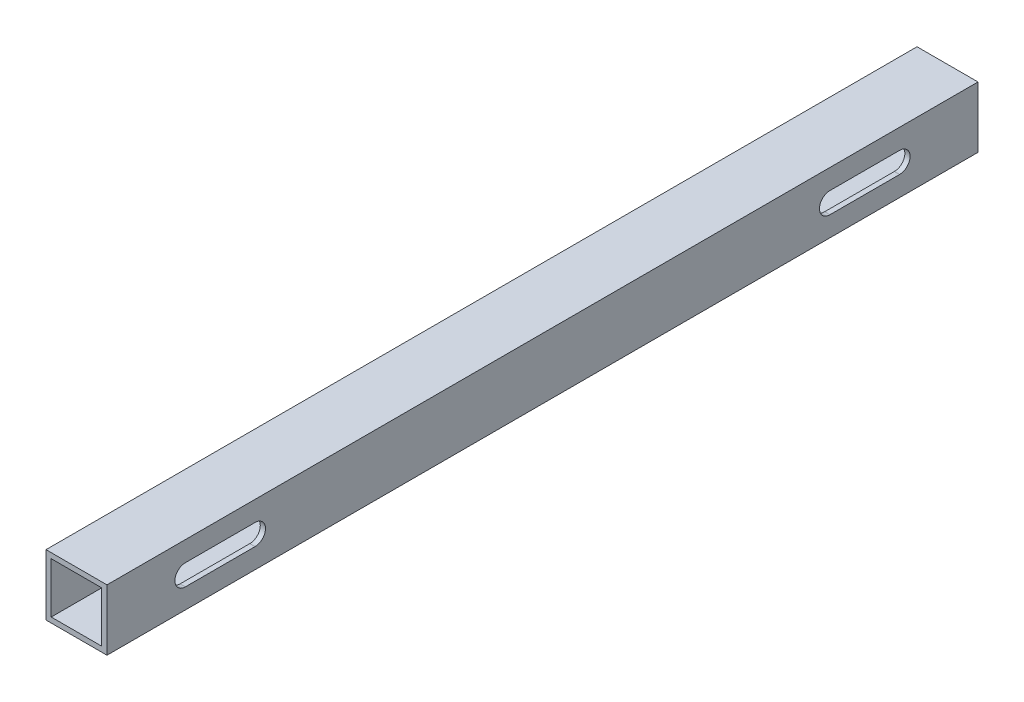
ISO-10303-21;
HEADER;
FILE_DESCRIPTION(('STEP AP214'),'2;1');
FILE_NAME('part.step','',(''),(''),'','','');
FILE_SCHEMA(('AUTOMOTIVE_DESIGN { 1 0 10303 214 1 1 1 1 }'));
ENDSEC;
DATA;
#1=APPLICATION_CONTEXT('core data for automotive mechanical design processes');
#2=APPLICATION_PROTOCOL_DEFINITION('international standard','automotive_design',2000,#1);
#3=PRODUCT_CONTEXT('',#1,'mechanical');
#4=PRODUCT('Part','Part','',(#3));
#5=PRODUCT_RELATED_PRODUCT_CATEGORY('part','',(#4));
#6=PRODUCT_DEFINITION_FORMATION('','',#4);
#7=PRODUCT_DEFINITION_CONTEXT('part definition',#1,'design');
#8=PRODUCT_DEFINITION('design','',#6,#7);
#9=PRODUCT_DEFINITION_SHAPE('','',#8);
#10=(LENGTH_UNIT() NAMED_UNIT(*) SI_UNIT(.MILLI.,.METRE.));
#11=(NAMED_UNIT(*) PLANE_ANGLE_UNIT() SI_UNIT($,.RADIAN.));
#12=(NAMED_UNIT(*) SI_UNIT($,.STERADIAN.) SOLID_ANGLE_UNIT());
#13=UNCERTAINTY_MEASURE_WITH_UNIT(LENGTH_MEASURE(1.E-05),#10,'distance_accuracy_value','');
#14=(GEOMETRIC_REPRESENTATION_CONTEXT(3) GLOBAL_UNCERTAINTY_ASSIGNED_CONTEXT((#13)) GLOBAL_UNIT_ASSIGNED_CONTEXT((#10,
#11,#12)) REPRESENTATION_CONTEXT('',''));
#15=CARTESIAN_POINT('',(0.,0.,0.));
#16=DIRECTION('',(0.,0.,1.));
#17=DIRECTION('',(1.,0.,0.));
#18=AXIS2_PLACEMENT_3D('',#15,#16,#17);
#19=CARTESIAN_POINT('',(0.,0.,500.));
#20=DIRECTION('',(0.,0.,-1.));
#21=DIRECTION('',(-1.,0.,0.));
#22=AXIS2_PLACEMENT_3D('',#19,#20,#21);
#23=PLANE('',#22);
#24=DIRECTION('',(0.,1.,0.));
#25=VECTOR('',#24,1.);
#26=CARTESIAN_POINT('',(17.5,-17.5,500.));
#27=LINE('',#26,#25);
#28=CARTESIAN_POINT('',(17.5,-17.5,500.));
#29=VERTEX_POINT('',#28);
#30=CARTESIAN_POINT('',(17.5,17.5,500.));
#31=VERTEX_POINT('',#30);
#32=EDGE_CURVE('E321',#29,#31,#27,.T.);
#33=ORIENTED_EDGE('',*,*,#32,.T.);
#34=DIRECTION('',(-1.,0.,0.));
#35=VECTOR('',#34,1.);
#36=CARTESIAN_POINT('',(-17.5,17.5,500.));
#37=LINE('',#36,#35);
#38=CARTESIAN_POINT('',(-17.5,17.5,500.));
#39=VERTEX_POINT('',#38);
#40=EDGE_CURVE('E324',#31,#39,#37,.T.);
#41=ORIENTED_EDGE('',*,*,#40,.T.);
#42=DIRECTION('',(0.,-1.,0.));
#43=VECTOR('',#42,1.);
#44=CARTESIAN_POINT('',(-17.5,-17.5,500.));
#45=LINE('',#44,#43);
#46=CARTESIAN_POINT('',(-17.5,-17.5,500.));
#47=VERTEX_POINT('',#46);
#48=EDGE_CURVE('E327',#39,#47,#45,.T.);
#49=ORIENTED_EDGE('',*,*,#48,.T.);
#50=DIRECTION('',(1.,0.,0.));
#51=VECTOR('',#50,1.);
#52=CARTESIAN_POINT('',(-17.5,-17.5,500.));
#53=LINE('',#52,#51);
#54=EDGE_CURVE('E329',#47,#29,#53,.T.);
#55=ORIENTED_EDGE('',*,*,#54,.T.);
#56=EDGE_LOOP('',(#33,#41,#49,#55));
#57=FACE_BOUND('',#56,.T.);
#58=DIRECTION('',(0.,1.,0.));
#59=VECTOR('',#58,1.);
#60=CARTESIAN_POINT('',(14.5,-14.5,500.));
#61=LINE('',#60,#59);
#62=CARTESIAN_POINT('',(14.5,-14.5,500.));
#63=VERTEX_POINT('',#62);
#64=CARTESIAN_POINT('',(14.5,14.5,500.));
#65=VERTEX_POINT('',#64);
#66=EDGE_CURVE('E290',#63,#65,#61,.T.);
#67=ORIENTED_EDGE('',*,*,#66,.F.);
#68=DIRECTION('',(1.,0.,0.));
#69=VECTOR('',#68,1.);
#70=CARTESIAN_POINT('',(-14.5,-14.5,500.));
#71=LINE('',#70,#69);
#72=CARTESIAN_POINT('',(-14.5,-14.5,500.));
#73=VERTEX_POINT('',#72);
#74=EDGE_CURVE('E298',#73,#63,#71,.T.);
#75=ORIENTED_EDGE('',*,*,#74,.F.);
#76=DIRECTION('',(0.,-1.,0.));
#77=VECTOR('',#76,1.);
#78=CARTESIAN_POINT('',(-14.5,-14.5,500.));
#79=LINE('',#78,#77);
#80=CARTESIAN_POINT('',(-14.5,14.5,500.));
#81=VERTEX_POINT('',#80);
#82=EDGE_CURVE('E295',#81,#73,#79,.T.);
#83=ORIENTED_EDGE('',*,*,#82,.F.);
#84=DIRECTION('',(-1.,0.,0.));
#85=VECTOR('',#84,1.);
#86=CARTESIAN_POINT('',(-14.5,14.5,500.));
#87=LINE('',#86,#85);
#88=EDGE_CURVE('E292',#65,#81,#87,.T.);
#89=ORIENTED_EDGE('',*,*,#88,.F.);
#90=EDGE_LOOP('',(#67,#75,#83,#89));
#91=FACE_BOUND('',#90,.T.);
#92=ADVANCED_FACE('F35',(#57,#91),#23,.F.);
#93=CARTESIAN_POINT('',(0.,0.,0.));
#94=DIRECTION('',(0.,0.,-1.));
#95=DIRECTION('',(-1.,0.,0.));
#96=AXIS2_PLACEMENT_3D('',#93,#94,#95);
#97=PLANE('',#96);
#98=DIRECTION('',(0.,1.,0.));
#99=VECTOR('',#98,1.);
#100=CARTESIAN_POINT('',(17.5,-17.5,0.));
#101=LINE('',#100,#99);
#102=CARTESIAN_POINT('',(17.5,-17.5,0.));
#103=VERTEX_POINT('',#102);
#104=CARTESIAN_POINT('',(17.5,17.5,0.));
#105=VERTEX_POINT('',#104);
#106=EDGE_CURVE('E320',#103,#105,#101,.T.);
#107=ORIENTED_EDGE('',*,*,#106,.F.);
#108=DIRECTION('',(1.,0.,0.));
#109=VECTOR('',#108,1.);
#110=CARTESIAN_POINT('',(-17.5,-17.5,0.));
#111=LINE('',#110,#109);
#112=CARTESIAN_POINT('',(-17.5,-17.5,0.));
#113=VERTEX_POINT('',#112);
#114=EDGE_CURVE('E325',#113,#103,#111,.T.);
#115=ORIENTED_EDGE('',*,*,#114,.F.);
#116=DIRECTION('',(0.,-1.,0.));
#117=VECTOR('',#116,1.);
#118=CARTESIAN_POINT('',(-17.5,-17.5,0.));
#119=LINE('',#118,#117);
#120=CARTESIAN_POINT('',(-17.5,17.5,0.));
#121=VERTEX_POINT('',#120);
#122=EDGE_CURVE('E336',#121,#113,#119,.T.);
#123=ORIENTED_EDGE('',*,*,#122,.F.);
#124=DIRECTION('',(-1.,0.,0.));
#125=VECTOR('',#124,1.);
#126=CARTESIAN_POINT('',(-17.5,17.5,0.));
#127=LINE('',#126,#125);
#128=EDGE_CURVE('E334',#105,#121,#127,.T.);
#129=ORIENTED_EDGE('',*,*,#128,.F.);
#130=EDGE_LOOP('',(#107,#115,#123,#129));
#131=FACE_BOUND('',#130,.T.);
#132=DIRECTION('',(1.,0.,0.));
#133=VECTOR('',#132,1.);
#134=CARTESIAN_POINT('',(-14.5,-14.5,0.));
#135=LINE('',#134,#133);
#136=CARTESIAN_POINT('',(-14.5,-14.5,0.));
#137=VERTEX_POINT('',#136);
#138=CARTESIAN_POINT('',(14.5,-14.5,0.));
#139=VERTEX_POINT('',#138);
#140=EDGE_CURVE('E293',#137,#139,#135,.T.);
#141=ORIENTED_EDGE('',*,*,#140,.T.);
#142=DIRECTION('',(0.,1.,0.));
#143=VECTOR('',#142,1.);
#144=CARTESIAN_POINT('',(14.5,-14.5,0.));
#145=LINE('',#144,#143);
#146=CARTESIAN_POINT('',(14.5,14.5,0.));
#147=VERTEX_POINT('',#146);
#148=EDGE_CURVE('E289',#139,#147,#145,.T.);
#149=ORIENTED_EDGE('',*,*,#148,.T.);
#150=DIRECTION('',(-1.,0.,0.));
#151=VECTOR('',#150,1.);
#152=CARTESIAN_POINT('',(-14.5,14.5,0.));
#153=LINE('',#152,#151);
#154=CARTESIAN_POINT('',(-14.5,14.5,0.));
#155=VERTEX_POINT('',#154);
#156=EDGE_CURVE('E303',#147,#155,#153,.T.);
#157=ORIENTED_EDGE('',*,*,#156,.T.);
#158=DIRECTION('',(0.,-1.,0.));
#159=VECTOR('',#158,1.);
#160=CARTESIAN_POINT('',(-14.5,-14.5,0.));
#161=LINE('',#160,#159);
#162=EDGE_CURVE('E306',#155,#137,#161,.T.);
#163=ORIENTED_EDGE('',*,*,#162,.T.);
#164=EDGE_LOOP('',(#141,#149,#157,#163));
#165=FACE_BOUND('',#164,.T.);
#166=ADVANCED_FACE('F410',(#131,#165),#97,.T.);
#167=CARTESIAN_POINT('',(17.5,-17.5,500.));
#168=DIRECTION('',(-1.,0.,0.));
#169=DIRECTION('',(0.,0.,1.));
#170=AXIS2_PLACEMENT_3D('',#167,#168,#169);
#171=PLANE('',#170);
#172=DIRECTION('',(0.,0.,-1.));
#173=VECTOR('',#172,1.);
#174=CARTESIAN_POINT('',(17.5,-6.,455.));
#175=LINE('',#174,#173);
#176=CARTESIAN_POINT('',(17.5,-6.,455.));
#177=VERTEX_POINT('',#176);
#178=CARTESIAN_POINT('',(17.5,-5.99999999999995,415.));
#179=VERTEX_POINT('',#178);
#180=EDGE_CURVE('E213',#177,#179,#175,.T.);
#181=ORIENTED_EDGE('',*,*,#180,.F.);
#182=CARTESIAN_POINT('',(17.5,0.,455.));
#183=DIRECTION('',(1.,0.,0.));
#184=DIRECTION('',(0.,0.,-1.));
#185=AXIS2_PLACEMENT_3D('',#182,#183,#184);
#186=CIRCLE('',#185,5.99999999999995);
#187=CARTESIAN_POINT('',(17.5,5.9999999999999,455.));
#188=VERTEX_POINT('',#187);
#189=EDGE_CURVE('E50',#188,#177,#186,.T.);
#190=ORIENTED_EDGE('',*,*,#189,.F.);
#191=DIRECTION('',(0.,0.,1.));
#192=VECTOR('',#191,1.);
#193=CARTESIAN_POINT('',(17.5,5.9999999999999,455.));
#194=LINE('',#193,#192);
#195=CARTESIAN_POINT('',(17.5,5.99999999999991,415.));
#196=VERTEX_POINT('',#195);
#197=EDGE_CURVE('E220',#196,#188,#194,.T.);
#198=ORIENTED_EDGE('',*,*,#197,.F.);
#199=CARTESIAN_POINT('',(17.5,0.,415.));
#200=DIRECTION('',(1.,0.,0.));
#201=DIRECTION('',(0.,0.,-1.));
#202=AXIS2_PLACEMENT_3D('',#199,#200,#201);
#203=CIRCLE('',#202,5.99999999999995);
#204=EDGE_CURVE('E203',#179,#196,#203,.T.);
#205=ORIENTED_EDGE('',*,*,#204,.F.);
#206=EDGE_LOOP('',(#181,#190,#198,#205));
#207=FACE_BOUND('',#206,.T.);
#208=DIRECTION('',(0.,0.,1.));
#209=VECTOR('',#208,1.);
#210=CARTESIAN_POINT('',(17.5,5.99999999999995,45.));
#211=LINE('',#210,#209);
#212=CARTESIAN_POINT('',(17.5,5.99999999999995,45.));
#213=VERTEX_POINT('',#212);
#214=CARTESIAN_POINT('',(17.5,5.99999999999999,85.));
#215=VERTEX_POINT('',#214);
#216=EDGE_CURVE('E250',#213,#215,#211,.T.);
#217=ORIENTED_EDGE('',*,*,#216,.F.);
#218=CARTESIAN_POINT('',(17.5,0.,45.));
#219=DIRECTION('',(1.,0.,0.));
#220=DIRECTION('',(0.,0.,-1.));
#221=AXIS2_PLACEMENT_3D('',#218,#219,#220);
#222=CIRCLE('',#221,5.99999999999995);
#223=CARTESIAN_POINT('',(17.5,-5.99999999999995,45.));
#224=VERTEX_POINT('',#223);
#225=EDGE_CURVE('E58',#224,#213,#222,.T.);
#226=ORIENTED_EDGE('',*,*,#225,.F.);
#227=DIRECTION('',(0.,0.,-1.));
#228=VECTOR('',#227,1.);
#229=CARTESIAN_POINT('',(17.5,-5.99999999999995,45.));
#230=LINE('',#229,#228);
#231=CARTESIAN_POINT('',(17.5,-5.99999999999996,85.));
#232=VERTEX_POINT('',#231);
#233=EDGE_CURVE('E256',#232,#224,#230,.T.);
#234=ORIENTED_EDGE('',*,*,#233,.F.);
#235=CARTESIAN_POINT('',(17.5,0.,85.));
#236=DIRECTION('',(1.,0.,0.));
#237=DIRECTION('',(0.,0.,-1.));
#238=AXIS2_PLACEMENT_3D('',#235,#236,#237);
#239=CIRCLE('',#238,5.99999999999995);
#240=EDGE_CURVE('E253',#215,#232,#239,.T.);
#241=ORIENTED_EDGE('',*,*,#240,.F.);
#242=EDGE_LOOP('',(#217,#226,#234,#241));
#243=FACE_BOUND('',#242,.T.);
#244=ORIENTED_EDGE('',*,*,#106,.T.);
#245=DIRECTION('',(0.,0.,-1.));
#246=VECTOR('',#245,1.);
#247=CARTESIAN_POINT('',(17.5,17.5,500.));
#248=LINE('',#247,#246);
#249=EDGE_CURVE('E347',#31,#105,#248,.T.);
#250=ORIENTED_EDGE('',*,*,#249,.F.);
#251=ORIENTED_EDGE('',*,*,#32,.F.);
#252=DIRECTION('',(0.,0.,-1.));
#253=VECTOR('',#252,1.);
#254=CARTESIAN_POINT('',(17.5,-17.5,500.));
#255=LINE('',#254,#253);
#256=EDGE_CURVE('E331',#29,#103,#255,.T.);
#257=ORIENTED_EDGE('',*,*,#256,.T.);
#258=EDGE_LOOP('',(#244,#250,#251,#257));
#259=FACE_BOUND('',#258,.T.);
#260=ADVANCED_FACE('F37',(#207,#243,#259),#171,.F.);
#261=CARTESIAN_POINT('',(-17.5,17.5,500.));
#262=DIRECTION('',(0.,-1.,0.));
#263=DIRECTION('',(0.,0.,-1.));
#264=AXIS2_PLACEMENT_3D('',#261,#262,#263);
#265=PLANE('',#264);
#266=ORIENTED_EDGE('',*,*,#128,.T.);
#267=DIRECTION('',(0.,0.,-1.));
#268=VECTOR('',#267,1.);
#269=CARTESIAN_POINT('',(-17.5,17.5,500.));
#270=LINE('',#269,#268);
#271=EDGE_CURVE('E344',#39,#121,#270,.T.);
#272=ORIENTED_EDGE('',*,*,#271,.F.);
#273=ORIENTED_EDGE('',*,*,#40,.F.);
#274=ORIENTED_EDGE('',*,*,#249,.T.);
#275=EDGE_LOOP('',(#266,#272,#273,#274));
#276=FACE_BOUND('',#275,.T.);
#277=ADVANCED_FACE('F394',(#276),#265,.F.);
#278=CARTESIAN_POINT('',(-17.5,-17.5,500.));
#279=DIRECTION('',(1.,0.,0.));
#280=DIRECTION('',(0.,0.,-1.));
#281=AXIS2_PLACEMENT_3D('',#278,#279,#280);
#282=PLANE('',#281);
#283=DIRECTION('',(0.,0.,-1.));
#284=VECTOR('',#283,1.);
#285=CARTESIAN_POINT('',(-17.5,5.9999999999999,455.));
#286=LINE('',#285,#284);
#287=CARTESIAN_POINT('',(-17.5,5.9999999999999,455.));
#288=VERTEX_POINT('',#287);
#289=CARTESIAN_POINT('',(-17.5,5.99999999999995,415.));
#290=VERTEX_POINT('',#289);
#291=EDGE_CURVE('E386',#288,#290,#286,.T.);
#292=ORIENTED_EDGE('',*,*,#291,.F.);
#293=CARTESIAN_POINT('',(-17.5,0.,455.));
#294=DIRECTION('',(1.,0.,0.));
#295=DIRECTION('',(0.,0.,-1.));
#296=AXIS2_PLACEMENT_3D('',#293,#294,#295);
#297=CIRCLE('',#296,5.99999999999995);
#298=CARTESIAN_POINT('',(-17.5,-6.,455.));
#299=VERTEX_POINT('',#298);
#300=EDGE_CURVE('E239',#299,#288,#297,.F.);
#301=ORIENTED_EDGE('',*,*,#300,.F.);
#302=DIRECTION('',(0.,0.,1.));
#303=VECTOR('',#302,1.);
#304=CARTESIAN_POINT('',(-17.5,-6.,455.));
#305=LINE('',#304,#303);
#306=CARTESIAN_POINT('',(-17.5,-6.,415.));
#307=VERTEX_POINT('',#306);
#308=EDGE_CURVE('E236',#307,#299,#305,.T.);
#309=ORIENTED_EDGE('',*,*,#308,.F.);
#310=CARTESIAN_POINT('',(-17.5,0.,415.));
#311=DIRECTION('',(1.,0.,0.));
#312=DIRECTION('',(0.,0.,-1.));
#313=AXIS2_PLACEMENT_3D('',#310,#311,#312);
#314=CIRCLE('',#313,5.99999999999995);
#315=EDGE_CURVE('E228',#290,#307,#314,.F.);
#316=ORIENTED_EDGE('',*,*,#315,.F.);
#317=EDGE_LOOP('',(#292,#301,#309,#316));
#318=FACE_BOUND('',#317,.T.);
#319=DIRECTION('',(0.,0.,1.));
#320=VECTOR('',#319,1.);
#321=CARTESIAN_POINT('',(-17.5,-5.99999999999995,45.));
#322=LINE('',#321,#320);
#323=CARTESIAN_POINT('',(-17.5,-5.99999999999995,45.));
#324=VERTEX_POINT('',#323);
#325=CARTESIAN_POINT('',(-17.5,-5.99999999999991,85.));
#326=VERTEX_POINT('',#325);
#327=EDGE_CURVE('E243',#324,#326,#322,.T.);
#328=ORIENTED_EDGE('',*,*,#327,.F.);
#329=CARTESIAN_POINT('',(-17.5,0.,45.));
#330=DIRECTION('',(1.,0.,0.));
#331=DIRECTION('',(0.,0.,-1.));
#332=AXIS2_PLACEMENT_3D('',#329,#330,#331);
#333=CIRCLE('',#332,5.99999999999995);
#334=CARTESIAN_POINT('',(-17.5,5.99999999999995,45.));
#335=VERTEX_POINT('',#334);
#336=EDGE_CURVE('E246',#335,#324,#333,.F.);
#337=ORIENTED_EDGE('',*,*,#336,.F.);
#338=DIRECTION('',(0.,0.,-1.));
#339=VECTOR('',#338,1.);
#340=CARTESIAN_POINT('',(-17.5,5.99999999999995,45.));
#341=LINE('',#340,#339);
#342=CARTESIAN_POINT('',(-17.5,5.99999999999995,85.));
#343=VERTEX_POINT('',#342);
#344=EDGE_CURVE('E248',#343,#335,#341,.T.);
#345=ORIENTED_EDGE('',*,*,#344,.F.);
#346=CARTESIAN_POINT('',(-17.5,0.,85.));
#347=DIRECTION('',(1.,0.,0.));
#348=DIRECTION('',(0.,0.,-1.));
#349=AXIS2_PLACEMENT_3D('',#346,#347,#348);
#350=CIRCLE('',#349,5.99999999999995);
#351=EDGE_CURVE('E240',#326,#343,#350,.F.);
#352=ORIENTED_EDGE('',*,*,#351,.F.);
#353=EDGE_LOOP('',(#328,#337,#345,#352));
#354=FACE_BOUND('',#353,.T.);
#355=ORIENTED_EDGE('',*,*,#122,.T.);
#356=DIRECTION('',(0.,0.,-1.));
#357=VECTOR('',#356,1.);
#358=CARTESIAN_POINT('',(-17.5,-17.5,500.));
#359=LINE('',#358,#357);
#360=EDGE_CURVE('E341',#47,#113,#359,.T.);
#361=ORIENTED_EDGE('',*,*,#360,.F.);
#362=ORIENTED_EDGE('',*,*,#48,.F.);
#363=ORIENTED_EDGE('',*,*,#271,.T.);
#364=EDGE_LOOP('',(#355,#361,#362,#363));
#365=FACE_BOUND('',#364,.T.);
#366=ADVANCED_FACE('F388',(#318,#354,#365),#282,.F.);
#367=CARTESIAN_POINT('',(-17.5,-17.5,500.));
#368=DIRECTION('',(0.,1.,0.));
#369=DIRECTION('',(0.,0.,1.));
#370=AXIS2_PLACEMENT_3D('',#367,#368,#369);
#371=PLANE('',#370);
#372=ORIENTED_EDGE('',*,*,#114,.T.);
#373=ORIENTED_EDGE('',*,*,#256,.F.);
#374=ORIENTED_EDGE('',*,*,#54,.F.);
#375=ORIENTED_EDGE('',*,*,#360,.T.);
#376=EDGE_LOOP('',(#372,#373,#374,#375));
#377=FACE_BOUND('',#376,.T.);
#378=ADVANCED_FACE('F393',(#377),#371,.F.);
#379=CARTESIAN_POINT('',(14.5,-14.5,500.));
#380=DIRECTION('',(-1.,0.,0.));
#381=DIRECTION('',(0.,0.,1.));
#382=AXIS2_PLACEMENT_3D('',#379,#380,#381);
#383=PLANE('',#382);
#384=CARTESIAN_POINT('',(14.5,0.,455.));
#385=DIRECTION('',(-1.,0.,0.));
#386=DIRECTION('',(0.,0.,1.));
#387=AXIS2_PLACEMENT_3D('',#384,#385,#386);
#388=CIRCLE('',#387,5.99999999999995);
#389=CARTESIAN_POINT('',(14.5,-6.,455.));
#390=VERTEX_POINT('',#389);
#391=CARTESIAN_POINT('',(14.5,5.9999999999999,455.));
#392=VERTEX_POINT('',#391);
#393=EDGE_CURVE('E287',#390,#392,#388,.T.);
#394=ORIENTED_EDGE('',*,*,#393,.F.);
#395=DIRECTION('',(0.,0.,1.));
#396=VECTOR('',#395,1.);
#397=CARTESIAN_POINT('',(14.5,-6.,500.));
#398=LINE('',#397,#396);
#399=CARTESIAN_POINT('',(14.5,-6.,415.));
#400=VERTEX_POINT('',#399);
#401=EDGE_CURVE('E282',#400,#390,#398,.T.);
#402=ORIENTED_EDGE('',*,*,#401,.F.);
#403=CARTESIAN_POINT('',(14.5,0.,415.));
#404=DIRECTION('',(-1.,0.,0.));
#405=DIRECTION('',(0.,0.,1.));
#406=AXIS2_PLACEMENT_3D('',#403,#404,#405);
#407=CIRCLE('',#406,5.99999999999995);
#408=CARTESIAN_POINT('',(14.5,5.99999999999991,415.));
#409=VERTEX_POINT('',#408);
#410=EDGE_CURVE('E206',#409,#400,#407,.T.);
#411=ORIENTED_EDGE('',*,*,#410,.F.);
#412=DIRECTION('',(0.,0.,-1.));
#413=VECTOR('',#412,1.);
#414=CARTESIAN_POINT('',(14.5,5.99999999999989,500.));
#415=LINE('',#414,#413);
#416=EDGE_CURVE('E285',#392,#409,#415,.T.);
#417=ORIENTED_EDGE('',*,*,#416,.F.);
#418=EDGE_LOOP('',(#394,#402,#411,#417));
#419=FACE_BOUND('',#418,.T.);
#420=CARTESIAN_POINT('',(14.5,0.,45.));
#421=DIRECTION('',(-1.,0.,0.));
#422=DIRECTION('',(0.,0.,1.));
#423=AXIS2_PLACEMENT_3D('',#420,#421,#422);
#424=CIRCLE('',#423,5.99999999999995);
#425=CARTESIAN_POINT('',(14.5,5.99999999999995,45.));
#426=VERTEX_POINT('',#425);
#427=CARTESIAN_POINT('',(14.5,-5.99999999999995,45.));
#428=VERTEX_POINT('',#427);
#429=EDGE_CURVE('E280',#426,#428,#424,.T.);
#430=ORIENTED_EDGE('',*,*,#429,.F.);
#431=DIRECTION('',(0.,0.,-1.));
#432=VECTOR('',#431,1.);
#433=CARTESIAN_POINT('',(14.5,5.99999999999994,500.));
#434=LINE('',#433,#432);
#435=CARTESIAN_POINT('',(14.5,5.99999999999995,85.));
#436=VERTEX_POINT('',#435);
#437=EDGE_CURVE('E238',#436,#426,#434,.T.);
#438=ORIENTED_EDGE('',*,*,#437,.F.);
#439=CARTESIAN_POINT('',(14.5,0.,85.));
#440=DIRECTION('',(-1.,0.,0.));
#441=DIRECTION('',(0.,0.,1.));
#442=AXIS2_PLACEMENT_3D('',#439,#440,#441);
#443=CIRCLE('',#442,5.99999999999995);
#444=CARTESIAN_POINT('',(14.5,-5.99999999999996,85.));
#445=VERTEX_POINT('',#444);
#446=EDGE_CURVE('E275',#445,#436,#443,.T.);
#447=ORIENTED_EDGE('',*,*,#446,.F.);
#448=DIRECTION('',(0.,0.,1.));
#449=VECTOR('',#448,1.);
#450=CARTESIAN_POINT('',(14.5,-6.00000000000006,500.));
#451=LINE('',#450,#449);
#452=EDGE_CURVE('E278',#428,#445,#451,.T.);
#453=ORIENTED_EDGE('',*,*,#452,.F.);
#454=EDGE_LOOP('',(#430,#438,#447,#453));
#455=FACE_BOUND('',#454,.T.);
#456=ORIENTED_EDGE('',*,*,#148,.F.);
#457=DIRECTION('',(0.,0.,-1.));
#458=VECTOR('',#457,1.);
#459=CARTESIAN_POINT('',(14.5,-14.5,500.));
#460=LINE('',#459,#458);
#461=EDGE_CURVE('E300',#63,#139,#460,.T.);
#462=ORIENTED_EDGE('',*,*,#461,.F.);
#463=ORIENTED_EDGE('',*,*,#66,.T.);
#464=DIRECTION('',(0.,0.,-1.));
#465=VECTOR('',#464,1.);
#466=CARTESIAN_POINT('',(14.5,14.5,500.));
#467=LINE('',#466,#465);
#468=EDGE_CURVE('E317',#65,#147,#467,.T.);
#469=ORIENTED_EDGE('',*,*,#468,.T.);
#470=EDGE_LOOP('',(#456,#462,#463,#469));
#471=FACE_BOUND('',#470,.T.);
#472=ADVANCED_FACE('F429',(#419,#455,#471),#383,.T.);
#473=CARTESIAN_POINT('',(-14.5,14.5,500.));
#474=DIRECTION('',(0.,-1.,0.));
#475=DIRECTION('',(0.,0.,-1.));
#476=AXIS2_PLACEMENT_3D('',#473,#474,#475);
#477=PLANE('',#476);
#478=ORIENTED_EDGE('',*,*,#156,.F.);
#479=ORIENTED_EDGE('',*,*,#468,.F.);
#480=ORIENTED_EDGE('',*,*,#88,.T.);
#481=DIRECTION('',(0.,0.,-1.));
#482=VECTOR('',#481,1.);
#483=CARTESIAN_POINT('',(-14.5,14.5,500.));
#484=LINE('',#483,#482);
#485=EDGE_CURVE('E315',#81,#155,#484,.T.);
#486=ORIENTED_EDGE('',*,*,#485,.T.);
#487=EDGE_LOOP('',(#478,#479,#480,#486));
#488=FACE_BOUND('',#487,.T.);
#489=ADVANCED_FACE('F436',(#488),#477,.T.);
#490=CARTESIAN_POINT('',(-14.5,-14.5,500.));
#491=DIRECTION('',(1.,0.,0.));
#492=DIRECTION('',(0.,0.,-1.));
#493=AXIS2_PLACEMENT_3D('',#490,#491,#492);
#494=PLANE('',#493);
#495=CARTESIAN_POINT('',(-14.5,0.,455.));
#496=DIRECTION('',(1.,0.,0.));
#497=DIRECTION('',(0.,0.,-1.));
#498=AXIS2_PLACEMENT_3D('',#495,#496,#497);
#499=CIRCLE('',#498,5.99999999999995);
#500=CARTESIAN_POINT('',(-14.5,5.9999999999999,455.));
#501=VERTEX_POINT('',#500);
#502=CARTESIAN_POINT('',(-14.5,-6.,455.));
#503=VERTEX_POINT('',#502);
#504=EDGE_CURVE('E11',#501,#503,#499,.T.);
#505=ORIENTED_EDGE('',*,*,#504,.F.);
#506=DIRECTION('',(0.,0.,1.));
#507=VECTOR('',#506,1.);
#508=CARTESIAN_POINT('',(-14.5,5.99999999999989,500.));
#509=LINE('',#508,#507);
#510=CARTESIAN_POINT('',(-14.5,5.99999999999991,415.));
#511=VERTEX_POINT('',#510);
#512=EDGE_CURVE('E43',#511,#501,#509,.T.);
#513=ORIENTED_EDGE('',*,*,#512,.F.);
#514=CARTESIAN_POINT('',(-14.5,0.,415.));
#515=DIRECTION('',(1.,0.,0.));
#516=DIRECTION('',(0.,0.,-1.));
#517=AXIS2_PLACEMENT_3D('',#514,#515,#516);
#518=CIRCLE('',#517,5.99999999999995);
#519=CARTESIAN_POINT('',(-14.5,-5.99999999999995,415.));
#520=VERTEX_POINT('',#519);
#521=EDGE_CURVE('E361',#520,#511,#518,.T.);
#522=ORIENTED_EDGE('',*,*,#521,.F.);
#523=DIRECTION('',(0.,0.,-1.));
#524=VECTOR('',#523,1.);
#525=CARTESIAN_POINT('',(-14.5,-6.,500.));
#526=LINE('',#525,#524);
#527=EDGE_CURVE('E359',#503,#520,#526,.T.);
#528=ORIENTED_EDGE('',*,*,#527,.F.);
#529=EDGE_LOOP('',(#505,#513,#522,#528));
#530=FACE_BOUND('',#529,.T.);
#531=CARTESIAN_POINT('',(-14.5,0.,45.));
#532=DIRECTION('',(1.,0.,0.));
#533=DIRECTION('',(0.,0.,-1.));
#534=AXIS2_PLACEMENT_3D('',#531,#532,#533);
#535=CIRCLE('',#534,5.99999999999995);
#536=CARTESIAN_POINT('',(-14.5,-5.99999999999995,45.));
#537=VERTEX_POINT('',#536);
#538=CARTESIAN_POINT('',(-14.5,5.99999999999995,45.));
#539=VERTEX_POINT('',#538);
#540=EDGE_CURVE('E356',#537,#539,#535,.T.);
#541=ORIENTED_EDGE('',*,*,#540,.F.);
#542=DIRECTION('',(0.,0.,-1.));
#543=VECTOR('',#542,1.);
#544=CARTESIAN_POINT('',(-14.5,-6.00000000000006,500.));
#545=LINE('',#544,#543);
#546=CARTESIAN_POINT('',(-14.5,-5.99999999999996,85.));
#547=VERTEX_POINT('',#546);
#548=EDGE_CURVE('E354',#547,#537,#545,.T.);
#549=ORIENTED_EDGE('',*,*,#548,.F.);
#550=CARTESIAN_POINT('',(-14.5,0.,85.));
#551=DIRECTION('',(1.,0.,0.));
#552=DIRECTION('',(0.,0.,-1.));
#553=AXIS2_PLACEMENT_3D('',#550,#551,#552);
#554=CIRCLE('',#553,5.99999999999995);
#555=CARTESIAN_POINT('',(-14.5,5.99999999999999,85.));
#556=VERTEX_POINT('',#555);
#557=EDGE_CURVE('E352',#556,#547,#554,.T.);
#558=ORIENTED_EDGE('',*,*,#557,.F.);
#559=DIRECTION('',(0.,0.,1.));
#560=VECTOR('',#559,1.);
#561=CARTESIAN_POINT('',(-14.5,5.99999999999994,500.));
#562=LINE('',#561,#560);
#563=EDGE_CURVE('E350',#539,#556,#562,.T.);
#564=ORIENTED_EDGE('',*,*,#563,.F.);
#565=EDGE_LOOP('',(#541,#549,#558,#564));
#566=FACE_BOUND('',#565,.T.);
#567=ORIENTED_EDGE('',*,*,#162,.F.);
#568=ORIENTED_EDGE('',*,*,#485,.F.);
#569=ORIENTED_EDGE('',*,*,#82,.T.);
#570=DIRECTION('',(0.,0.,-1.));
#571=VECTOR('',#570,1.);
#572=CARTESIAN_POINT('',(-14.5,-14.5,500.));
#573=LINE('',#572,#571);
#574=EDGE_CURVE('E313',#73,#137,#573,.T.);
#575=ORIENTED_EDGE('',*,*,#574,.T.);
#576=EDGE_LOOP('',(#567,#568,#569,#575));
#577=FACE_BOUND('',#576,.T.);
#578=ADVANCED_FACE('F376',(#530,#566,#577),#494,.T.);
#579=CARTESIAN_POINT('',(-14.5,-14.5,500.));
#580=DIRECTION('',(0.,1.,0.));
#581=DIRECTION('',(0.,0.,1.));
#582=AXIS2_PLACEMENT_3D('',#579,#580,#581);
#583=PLANE('',#582);
#584=ORIENTED_EDGE('',*,*,#140,.F.);
#585=ORIENTED_EDGE('',*,*,#574,.F.);
#586=ORIENTED_EDGE('',*,*,#74,.T.);
#587=ORIENTED_EDGE('',*,*,#461,.T.);
#588=EDGE_LOOP('',(#584,#585,#586,#587));
#589=FACE_BOUND('',#588,.T.);
#590=ADVANCED_FACE('F454',(#589),#583,.T.);
#591=CARTESIAN_POINT('',(-70.8666562565052,5.99999999999995,45.));
#592=DIRECTION('',(0.,1.,0.));
#593=DIRECTION('',(0.,0.,1.));
#594=AXIS2_PLACEMENT_3D('',#591,#592,#593);
#595=PLANE('',#594);
#596=ORIENTED_EDGE('',*,*,#563,.T.);
#597=DIRECTION('',(1.,0.,0.));
#598=VECTOR('',#597,1.);
#599=CARTESIAN_POINT('',(-70.8666562565052,5.99999999999999,85.));
#600=LINE('',#599,#598);
#601=EDGE_CURVE('E267',#343,#556,#600,.T.);
#602=ORIENTED_EDGE('',*,*,#601,.F.);
#603=ORIENTED_EDGE('',*,*,#344,.T.);
#604=DIRECTION('',(1.,0.,0.));
#605=VECTOR('',#604,1.);
#606=CARTESIAN_POINT('',(-70.8666562565052,5.99999999999995,45.));
#607=LINE('',#606,#605);
#608=EDGE_CURVE('E271',#335,#539,#607,.T.);
#609=ORIENTED_EDGE('',*,*,#608,.T.);
#610=EDGE_LOOP('',(#596,#602,#603,#609));
#611=FACE_BOUND('',#610,.T.);
#612=ADVANCED_FACE('F466',(#611),#595,.F.);
#613=CARTESIAN_POINT('',(-70.8666562565052,0.,85.));
#614=DIRECTION('',(1.,0.,0.));
#615=DIRECTION('',(0.,0.,-1.));
#616=AXIS2_PLACEMENT_3D('',#613,#614,#615);
#617=CYLINDRICAL_SURFACE('',#616,5.99999999999995);
#618=ORIENTED_EDGE('',*,*,#557,.T.);
#619=DIRECTION('',(1.,0.,0.));
#620=VECTOR('',#619,1.);
#621=CARTESIAN_POINT('',(-70.8666562565052,-5.99999999999996,85.));
#622=LINE('',#621,#620);
#623=EDGE_CURVE('E263',#326,#547,#622,.T.);
#624=ORIENTED_EDGE('',*,*,#623,.F.);
#625=ORIENTED_EDGE('',*,*,#351,.T.);
#626=ORIENTED_EDGE('',*,*,#601,.T.);
#627=EDGE_LOOP('',(#618,#624,#625,#626));
#628=FACE_BOUND('',#627,.T.);
#629=ADVANCED_FACE('F477',(#628),#617,.F.);
#630=CARTESIAN_POINT('',(-70.8666562565052,-5.99999999999995,45.));
#631=DIRECTION('',(0.,-1.,0.));
#632=DIRECTION('',(0.,0.,-1.));
#633=AXIS2_PLACEMENT_3D('',#630,#631,#632);
#634=PLANE('',#633);
#635=ORIENTED_EDGE('',*,*,#548,.T.);
#636=DIRECTION('',(1.,0.,0.));
#637=VECTOR('',#636,1.);
#638=CARTESIAN_POINT('',(-70.8666562565052,-5.99999999999995,45.));
#639=LINE('',#638,#637);
#640=EDGE_CURVE('E244',#324,#537,#639,.T.);
#641=ORIENTED_EDGE('',*,*,#640,.F.);
#642=ORIENTED_EDGE('',*,*,#327,.T.);
#643=ORIENTED_EDGE('',*,*,#623,.T.);
#644=EDGE_LOOP('',(#635,#641,#642,#643));
#645=FACE_BOUND('',#644,.T.);
#646=ADVANCED_FACE('F472',(#645),#634,.F.);
#647=CARTESIAN_POINT('',(-70.8666562565052,0.,45.));
#648=DIRECTION('',(1.,0.,0.));
#649=DIRECTION('',(0.,0.,-1.));
#650=AXIS2_PLACEMENT_3D('',#647,#648,#649);
#651=CYLINDRICAL_SURFACE('',#650,5.99999999999995);
#652=ORIENTED_EDGE('',*,*,#540,.T.);
#653=ORIENTED_EDGE('',*,*,#608,.F.);
#654=ORIENTED_EDGE('',*,*,#336,.T.);
#655=ORIENTED_EDGE('',*,*,#640,.T.);
#656=EDGE_LOOP('',(#652,#653,#654,#655));
#657=FACE_BOUND('',#656,.T.);
#658=ADVANCED_FACE('F469',(#657),#651,.F.);
#659=CARTESIAN_POINT('',(-70.8666562565052,-6.,455.));
#660=DIRECTION('',(0.,-1.,0.));
#661=DIRECTION('',(0.,0.,-1.));
#662=AXIS2_PLACEMENT_3D('',#659,#660,#661);
#663=PLANE('',#662);
#664=ORIENTED_EDGE('',*,*,#527,.T.);
#665=DIRECTION('',(1.,0.,0.));
#666=VECTOR('',#665,1.);
#667=CARTESIAN_POINT('',(-70.8666562565052,-5.99999999999995,415.));
#668=LINE('',#667,#666);
#669=EDGE_CURVE('E209',#307,#520,#668,.T.);
#670=ORIENTED_EDGE('',*,*,#669,.F.);
#671=ORIENTED_EDGE('',*,*,#308,.T.);
#672=DIRECTION('',(1.,0.,0.));
#673=VECTOR('',#672,1.);
#674=CARTESIAN_POINT('',(-70.8666562565052,-6.,455.));
#675=LINE('',#674,#673);
#676=EDGE_CURVE('E210',#299,#503,#675,.T.);
#677=ORIENTED_EDGE('',*,*,#676,.T.);
#678=EDGE_LOOP('',(#664,#670,#671,#677));
#679=FACE_BOUND('',#678,.T.);
#680=ADVANCED_FACE('F379',(#679),#663,.F.);
#681=CARTESIAN_POINT('',(-70.8666562565052,0.,415.));
#682=DIRECTION('',(1.,0.,0.));
#683=DIRECTION('',(0.,0.,-1.));
#684=AXIS2_PLACEMENT_3D('',#681,#682,#683);
#685=CYLINDRICAL_SURFACE('',#684,5.99999999999995);
#686=ORIENTED_EDGE('',*,*,#521,.T.);
#687=DIRECTION('',(1.,0.,0.));
#688=VECTOR('',#687,1.);
#689=CARTESIAN_POINT('',(-70.8666562565052,5.99999999999991,415.));
#690=LINE('',#689,#688);
#691=EDGE_CURVE('E230',#290,#511,#690,.T.);
#692=ORIENTED_EDGE('',*,*,#691,.F.);
#693=ORIENTED_EDGE('',*,*,#315,.T.);
#694=ORIENTED_EDGE('',*,*,#669,.T.);
#695=EDGE_LOOP('',(#686,#692,#693,#694));
#696=FACE_BOUND('',#695,.T.);
#697=ADVANCED_FACE('F382',(#696),#685,.F.);
#698=CARTESIAN_POINT('',(-70.8666562565052,5.9999999999999,455.));
#699=DIRECTION('',(0.,1.,0.));
#700=DIRECTION('',(0.,0.,1.));
#701=AXIS2_PLACEMENT_3D('',#698,#699,#700);
#702=PLANE('',#701);
#703=ORIENTED_EDGE('',*,*,#512,.T.);
#704=DIRECTION('',(1.,0.,0.));
#705=VECTOR('',#704,1.);
#706=CARTESIAN_POINT('',(-70.8666562565052,5.9999999999999,455.));
#707=LINE('',#706,#705);
#708=EDGE_CURVE('E225',#288,#501,#707,.T.);
#709=ORIENTED_EDGE('',*,*,#708,.F.);
#710=ORIENTED_EDGE('',*,*,#291,.T.);
#711=ORIENTED_EDGE('',*,*,#691,.T.);
#712=EDGE_LOOP('',(#703,#709,#710,#711));
#713=FACE_BOUND('',#712,.T.);
#714=ADVANCED_FACE('F365',(#713),#702,.F.);
#715=CARTESIAN_POINT('',(-70.8666562565052,0.,455.));
#716=DIRECTION('',(1.,0.,0.));
#717=DIRECTION('',(0.,0.,-1.));
#718=AXIS2_PLACEMENT_3D('',#715,#716,#717);
#719=CYLINDRICAL_SURFACE('',#718,5.99999999999995);
#720=ORIENTED_EDGE('',*,*,#504,.T.);
#721=ORIENTED_EDGE('',*,*,#676,.F.);
#722=ORIENTED_EDGE('',*,*,#300,.T.);
#723=ORIENTED_EDGE('',*,*,#708,.T.);
#724=EDGE_LOOP('',(#720,#721,#722,#723));
#725=FACE_BOUND('',#724,.T.);
#726=ADVANCED_FACE('F372',(#725),#719,.F.);
#727=ORIENTED_EDGE('',*,*,#429,.T.);
#728=EDGE_CURVE('E262',#428,#224,#639,.T.);
#729=ORIENTED_EDGE('',*,*,#728,.T.);
#730=ORIENTED_EDGE('',*,*,#225,.T.);
#731=EDGE_CURVE('E259',#426,#213,#607,.T.);
#732=ORIENTED_EDGE('',*,*,#731,.F.);
#733=EDGE_LOOP('',(#727,#729,#730,#732));
#734=FACE_BOUND('',#733,.T.);
#735=ADVANCED_FACE('F474',(#734),#651,.F.);
#736=ORIENTED_EDGE('',*,*,#452,.T.);
#737=EDGE_CURVE('E266',#445,#232,#622,.T.);
#738=ORIENTED_EDGE('',*,*,#737,.T.);
#739=ORIENTED_EDGE('',*,*,#233,.T.);
#740=ORIENTED_EDGE('',*,*,#728,.F.);
#741=EDGE_LOOP('',(#736,#738,#739,#740));
#742=FACE_BOUND('',#741,.T.);
#743=ADVANCED_FACE('F487',(#742),#634,.F.);
#744=ORIENTED_EDGE('',*,*,#446,.T.);
#745=EDGE_CURVE('E270',#436,#215,#600,.T.);
#746=ORIENTED_EDGE('',*,*,#745,.T.);
#747=ORIENTED_EDGE('',*,*,#240,.T.);
#748=ORIENTED_EDGE('',*,*,#737,.F.);
#749=EDGE_LOOP('',(#744,#746,#747,#748));
#750=FACE_BOUND('',#749,.T.);
#751=ADVANCED_FACE('F483',(#750),#617,.F.);
#752=ORIENTED_EDGE('',*,*,#437,.T.);
#753=ORIENTED_EDGE('',*,*,#731,.T.);
#754=ORIENTED_EDGE('',*,*,#216,.T.);
#755=ORIENTED_EDGE('',*,*,#745,.F.);
#756=EDGE_LOOP('',(#752,#753,#754,#755));
#757=FACE_BOUND('',#756,.T.);
#758=ADVANCED_FACE('F479',(#757),#595,.F.);
#759=ORIENTED_EDGE('',*,*,#393,.T.);
#760=EDGE_CURVE('E229',#392,#188,#707,.T.);
#761=ORIENTED_EDGE('',*,*,#760,.T.);
#762=ORIENTED_EDGE('',*,*,#189,.T.);
#763=EDGE_CURVE('E215',#390,#177,#675,.T.);
#764=ORIENTED_EDGE('',*,*,#763,.F.);
#765=EDGE_LOOP('',(#759,#761,#762,#764));
#766=FACE_BOUND('',#765,.T.);
#767=ADVANCED_FACE('F490',(#766),#719,.F.);
#768=ORIENTED_EDGE('',*,*,#416,.T.);
#769=EDGE_CURVE('E232',#409,#196,#690,.T.);
#770=ORIENTED_EDGE('',*,*,#769,.T.);
#771=ORIENTED_EDGE('',*,*,#197,.T.);
#772=ORIENTED_EDGE('',*,*,#760,.F.);
#773=EDGE_LOOP('',(#768,#770,#771,#772));
#774=FACE_BOUND('',#773,.T.);
#775=ADVANCED_FACE('F496',(#774),#702,.F.);
#776=ORIENTED_EDGE('',*,*,#410,.T.);
#777=EDGE_CURVE('E198',#400,#179,#668,.T.);
#778=ORIENTED_EDGE('',*,*,#777,.T.);
#779=ORIENTED_EDGE('',*,*,#204,.T.);
#780=ORIENTED_EDGE('',*,*,#769,.F.);
#781=EDGE_LOOP('',(#776,#778,#779,#780));
#782=FACE_BOUND('',#781,.T.);
#783=ADVANCED_FACE('F200',(#782),#685,.F.);
#784=ORIENTED_EDGE('',*,*,#401,.T.);
#785=ORIENTED_EDGE('',*,*,#763,.T.);
#786=ORIENTED_EDGE('',*,*,#180,.T.);
#787=ORIENTED_EDGE('',*,*,#777,.F.);
#788=EDGE_LOOP('',(#784,#785,#786,#787));
#789=FACE_BOUND('',#788,.T.);
#790=ADVANCED_FACE('F214',(#789),#663,.F.);
#791=CLOSED_SHELL('',(#92,#166,#260,#277,#366,#378,#472,#489,#578,#590,#612,#629,#646,#658,#680,
#697,#714,#726,#735,#743,#751,#758,#767,#775,#783,#790));
#792=MANIFOLD_SOLID_BREP('B2',#791);
#793=ADVANCED_BREP_SHAPE_REPRESENTATION('',(#18,#792),#14);
#794=SHAPE_DEFINITION_REPRESENTATION(#9,#793);
ENDSEC;
END-ISO-10303-21;
